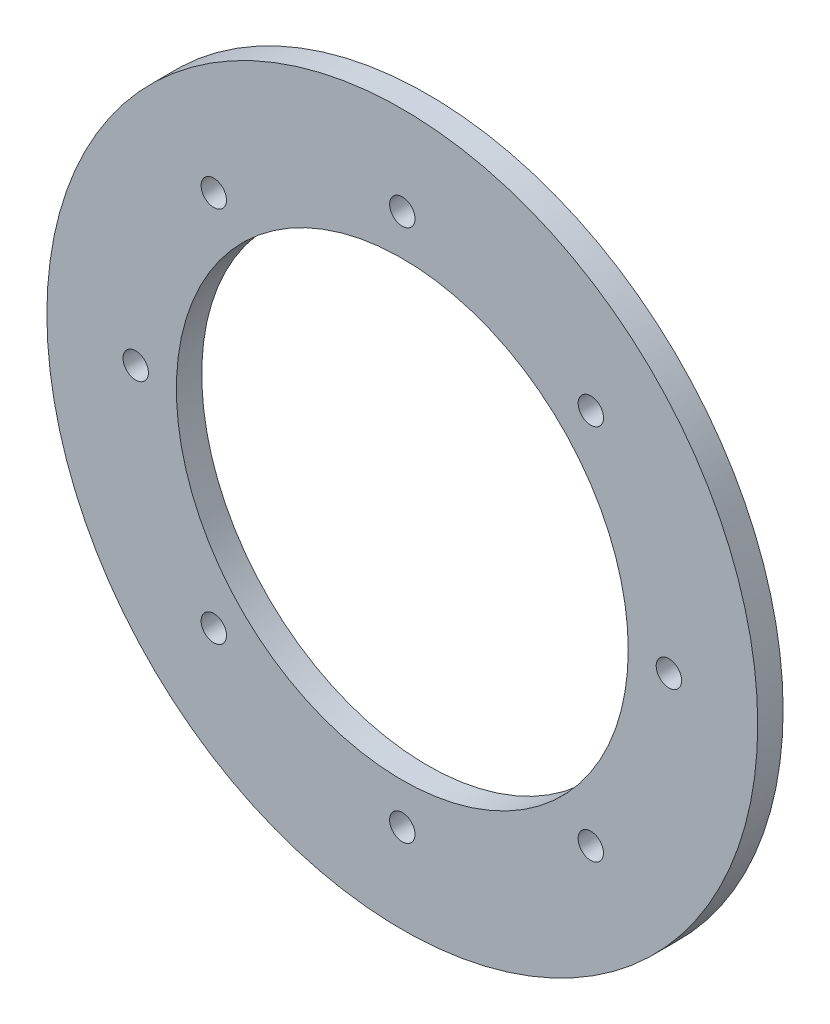
ISO-10303-21;
HEADER;
FILE_DESCRIPTION(('STEP AP214'),'2;1');
FILE_NAME('part.step','',(''),(''),'','','');
FILE_SCHEMA(('AUTOMOTIVE_DESIGN { 1 0 10303 214 1 1 1 1 }'));
ENDSEC;
DATA;
#1=APPLICATION_CONTEXT('core data for automotive mechanical design processes');
#2=APPLICATION_PROTOCOL_DEFINITION('international standard','automotive_design',2000,#1);
#3=PRODUCT_CONTEXT('',#1,'mechanical');
#4=PRODUCT('Part','Part','',(#3));
#5=PRODUCT_RELATED_PRODUCT_CATEGORY('part','',(#4));
#6=PRODUCT_DEFINITION_FORMATION('','',#4);
#7=PRODUCT_DEFINITION_CONTEXT('part definition',#1,'design');
#8=PRODUCT_DEFINITION('design','',#6,#7);
#9=PRODUCT_DEFINITION_SHAPE('','',#8);
#10=(LENGTH_UNIT() NAMED_UNIT(*) SI_UNIT(.MILLI.,.METRE.));
#11=(NAMED_UNIT(*) PLANE_ANGLE_UNIT() SI_UNIT($,.RADIAN.));
#12=(NAMED_UNIT(*) SI_UNIT($,.STERADIAN.) SOLID_ANGLE_UNIT());
#13=UNCERTAINTY_MEASURE_WITH_UNIT(LENGTH_MEASURE(1.E-05),#10,'distance_accuracy_value','');
#14=(GEOMETRIC_REPRESENTATION_CONTEXT(3) GLOBAL_UNCERTAINTY_ASSIGNED_CONTEXT((#13)) GLOBAL_UNIT_ASSIGNED_CONTEXT((#10,
#11,#12)) REPRESENTATION_CONTEXT('',''));
#15=CARTESIAN_POINT('',(0.,0.,0.));
#16=DIRECTION('',(0.,0.,1.));
#17=DIRECTION('',(1.,0.,0.));
#18=AXIS2_PLACEMENT_3D('',#15,#16,#17);
#19=CARTESIAN_POINT('',(0.,0.,5.));
#20=DIRECTION('',(0.,0.,1.));
#21=DIRECTION('',(1.,0.,0.));
#22=AXIS2_PLACEMENT_3D('',#19,#20,#21);
#23=PLANE('',#22);
#24=CARTESIAN_POINT('',(-37.1231060122937,37.1231060122937,5.));
#25=DIRECTION('',(0.,0.,1.));
#26=DIRECTION('',(1.,0.,0.));
#27=AXIS2_PLACEMENT_3D('',#24,#25,#26);
#28=CIRCLE('',#27,2.5);
#29=CARTESIAN_POINT('',(-34.6231060122937,37.1231060122937,5.));
#30=VERTEX_POINT('',#29);
#31=EDGE_CURVE('E87',#30,#30,#28,.T.);
#32=ORIENTED_EDGE('',*,*,#31,.F.);
#33=EDGE_LOOP('',(#32));
#34=FACE_BOUND('',#33,.T.);
#35=CARTESIAN_POINT('',(-52.5,0.,5.));
#36=DIRECTION('',(0.,0.,1.));
#37=DIRECTION('',(1.,0.,0.));
#38=AXIS2_PLACEMENT_3D('',#35,#36,#37);
#39=CIRCLE('',#38,2.49999999999999);
#40=CARTESIAN_POINT('',(-50.,0.,5.));
#41=VERTEX_POINT('',#40);
#42=EDGE_CURVE('E75',#41,#41,#39,.T.);
#43=ORIENTED_EDGE('',*,*,#42,.F.);
#44=EDGE_LOOP('',(#43));
#45=FACE_BOUND('',#44,.T.);
#46=CARTESIAN_POINT('',(0.,-52.5,5.));
#47=DIRECTION('',(0.,0.,1.));
#48=DIRECTION('',(1.,0.,0.));
#49=AXIS2_PLACEMENT_3D('',#46,#47,#48);
#50=CIRCLE('',#49,2.5);
#51=CARTESIAN_POINT('',(2.5,-52.5,5.));
#52=VERTEX_POINT('',#51);
#53=EDGE_CURVE('E63',#52,#52,#50,.T.);
#54=ORIENTED_EDGE('',*,*,#53,.F.);
#55=EDGE_LOOP('',(#54));
#56=FACE_BOUND('',#55,.T.);
#57=CARTESIAN_POINT('',(37.1231060122937,-37.1231060122937,5.));
#58=DIRECTION('',(0.,0.,1.));
#59=DIRECTION('',(1.,0.,0.));
#60=AXIS2_PLACEMENT_3D('',#57,#58,#59);
#61=CIRCLE('',#60,2.5);
#62=CARTESIAN_POINT('',(39.6231060122937,-37.1231060122937,5.));
#63=VERTEX_POINT('',#62);
#64=EDGE_CURVE('E51',#63,#63,#61,.T.);
#65=ORIENTED_EDGE('',*,*,#64,.F.);
#66=EDGE_LOOP('',(#65));
#67=FACE_BOUND('',#66,.T.);
#68=CARTESIAN_POINT('',(0.,0.,5.));
#69=DIRECTION('',(0.,0.,1.));
#70=DIRECTION('',(1.,0.,0.));
#71=AXIS2_PLACEMENT_3D('',#68,#69,#70);
#72=CIRCLE('',#71,70.);
#73=CARTESIAN_POINT('',(70.,0.,5.));
#74=VERTEX_POINT('',#73);
#75=EDGE_CURVE('E10',#74,#74,#72,.T.);
#76=ORIENTED_EDGE('',*,*,#75,.T.);
#77=EDGE_LOOP('',(#76));
#78=FACE_BOUND('',#77,.T.);
#79=CARTESIAN_POINT('',(0.,0.,5.));
#80=DIRECTION('',(0.,0.,1.));
#81=DIRECTION('',(1.,0.,0.));
#82=AXIS2_PLACEMENT_3D('',#79,#80,#81);
#83=CIRCLE('',#82,44.5);
#84=CARTESIAN_POINT('',(44.5,0.,5.));
#85=VERTEX_POINT('',#84);
#86=EDGE_CURVE('E46',#85,#85,#83,.T.);
#87=ORIENTED_EDGE('',*,*,#86,.F.);
#88=EDGE_LOOP('',(#87));
#89=FACE_BOUND('',#88,.T.);
#90=CARTESIAN_POINT('',(52.5,0.,5.));
#91=DIRECTION('',(0.,0.,1.));
#92=DIRECTION('',(1.,0.,0.));
#93=AXIS2_PLACEMENT_3D('',#90,#91,#92);
#94=CIRCLE('',#93,2.5);
#95=CARTESIAN_POINT('',(55.,0.,5.));
#96=VERTEX_POINT('',#95);
#97=EDGE_CURVE('E57',#96,#96,#94,.T.);
#98=ORIENTED_EDGE('',*,*,#97,.F.);
#99=EDGE_LOOP('',(#98));
#100=FACE_BOUND('',#99,.T.);
#101=CARTESIAN_POINT('',(-37.1231060122937,-37.1231060122937,5.));
#102=DIRECTION('',(0.,0.,1.));
#103=DIRECTION('',(1.,0.,0.));
#104=AXIS2_PLACEMENT_3D('',#101,#102,#103);
#105=CIRCLE('',#104,2.5);
#106=CARTESIAN_POINT('',(-34.6231060122937,-37.1231060122937,5.));
#107=VERTEX_POINT('',#106);
#108=EDGE_CURVE('E69',#107,#107,#105,.T.);
#109=ORIENTED_EDGE('',*,*,#108,.F.);
#110=EDGE_LOOP('',(#109));
#111=FACE_BOUND('',#110,.T.);
#112=CARTESIAN_POINT('',(37.1231060122937,37.1231060122937,5.));
#113=DIRECTION('',(0.,0.,1.));
#114=DIRECTION('',(1.,0.,0.));
#115=AXIS2_PLACEMENT_3D('',#112,#113,#114);
#116=CIRCLE('',#115,2.5);
#117=CARTESIAN_POINT('',(39.6231060122937,37.1231060122937,5.));
#118=VERTEX_POINT('',#117);
#119=EDGE_CURVE('E81',#118,#118,#116,.T.);
#120=ORIENTED_EDGE('',*,*,#119,.F.);
#121=EDGE_LOOP('',(#120));
#122=FACE_BOUND('',#121,.T.);
#123=CARTESIAN_POINT('',(0.,52.5,5.));
#124=DIRECTION('',(0.,0.,1.));
#125=DIRECTION('',(1.,0.,0.));
#126=AXIS2_PLACEMENT_3D('',#123,#124,#125);
#127=CIRCLE('',#126,2.5);
#128=CARTESIAN_POINT('',(2.5,52.5,5.));
#129=VERTEX_POINT('',#128);
#130=EDGE_CURVE('E93',#129,#129,#127,.T.);
#131=ORIENTED_EDGE('',*,*,#130,.F.);
#132=EDGE_LOOP('',(#131));
#133=FACE_BOUND('',#132,.T.);
#134=ADVANCED_FACE('F35',(#34,#45,#56,#67,#78,#89,#100,#111,#122,#133),#23,.T.);
#135=CARTESIAN_POINT('',(0.,0.,0.));
#136=DIRECTION('',(0.,0.,1.));
#137=DIRECTION('',(1.,0.,0.));
#138=AXIS2_PLACEMENT_3D('',#135,#136,#137);
#139=PLANE('',#138);
#140=CARTESIAN_POINT('',(0.,0.,0.));
#141=DIRECTION('',(0.,0.,1.));
#142=DIRECTION('',(1.,0.,0.));
#143=AXIS2_PLACEMENT_3D('',#140,#141,#142);
#144=CIRCLE('',#143,70.);
#145=CARTESIAN_POINT('',(70.,0.,0.));
#146=VERTEX_POINT('',#145);
#147=EDGE_CURVE('E39',#146,#146,#144,.T.);
#148=ORIENTED_EDGE('',*,*,#147,.F.);
#149=EDGE_LOOP('',(#148));
#150=FACE_BOUND('',#149,.T.);
#151=CARTESIAN_POINT('',(0.,0.,0.));
#152=DIRECTION('',(0.,0.,1.));
#153=DIRECTION('',(1.,0.,0.));
#154=AXIS2_PLACEMENT_3D('',#151,#152,#153);
#155=CIRCLE('',#154,44.5);
#156=CARTESIAN_POINT('',(44.5,0.,0.));
#157=VERTEX_POINT('',#156);
#158=EDGE_CURVE('E48',#157,#157,#155,.T.);
#159=ORIENTED_EDGE('',*,*,#158,.T.);
#160=EDGE_LOOP('',(#159));
#161=FACE_BOUND('',#160,.T.);
#162=CARTESIAN_POINT('',(37.1231060122937,-37.1231060122937,0.));
#163=DIRECTION('',(0.,0.,1.));
#164=DIRECTION('',(1.,0.,0.));
#165=AXIS2_PLACEMENT_3D('',#162,#163,#164);
#166=CIRCLE('',#165,2.5);
#167=CARTESIAN_POINT('',(39.6231060122937,-37.1231060122937,0.));
#168=VERTEX_POINT('',#167);
#169=EDGE_CURVE('E54',#168,#168,#166,.T.);
#170=ORIENTED_EDGE('',*,*,#169,.T.);
#171=EDGE_LOOP('',(#170));
#172=FACE_BOUND('',#171,.T.);
#173=CARTESIAN_POINT('',(52.5,0.,0.));
#174=DIRECTION('',(0.,0.,1.));
#175=DIRECTION('',(1.,0.,0.));
#176=AXIS2_PLACEMENT_3D('',#173,#174,#175);
#177=CIRCLE('',#176,2.5);
#178=CARTESIAN_POINT('',(55.,0.,0.));
#179=VERTEX_POINT('',#178);
#180=EDGE_CURVE('E60',#179,#179,#177,.T.);
#181=ORIENTED_EDGE('',*,*,#180,.T.);
#182=EDGE_LOOP('',(#181));
#183=FACE_BOUND('',#182,.T.);
#184=CARTESIAN_POINT('',(0.,-52.5,0.));
#185=DIRECTION('',(0.,0.,1.));
#186=DIRECTION('',(1.,0.,0.));
#187=AXIS2_PLACEMENT_3D('',#184,#185,#186);
#188=CIRCLE('',#187,2.5);
#189=CARTESIAN_POINT('',(2.5,-52.5,0.));
#190=VERTEX_POINT('',#189);
#191=EDGE_CURVE('E66',#190,#190,#188,.T.);
#192=ORIENTED_EDGE('',*,*,#191,.T.);
#193=EDGE_LOOP('',(#192));
#194=FACE_BOUND('',#193,.T.);
#195=CARTESIAN_POINT('',(-37.1231060122937,-37.1231060122937,0.));
#196=DIRECTION('',(0.,0.,1.));
#197=DIRECTION('',(1.,0.,0.));
#198=AXIS2_PLACEMENT_3D('',#195,#196,#197);
#199=CIRCLE('',#198,2.5);
#200=CARTESIAN_POINT('',(-34.6231060122937,-37.1231060122937,0.));
#201=VERTEX_POINT('',#200);
#202=EDGE_CURVE('E72',#201,#201,#199,.T.);
#203=ORIENTED_EDGE('',*,*,#202,.T.);
#204=EDGE_LOOP('',(#203));
#205=FACE_BOUND('',#204,.T.);
#206=CARTESIAN_POINT('',(-52.5,0.,0.));
#207=DIRECTION('',(0.,0.,1.));
#208=DIRECTION('',(1.,0.,0.));
#209=AXIS2_PLACEMENT_3D('',#206,#207,#208);
#210=CIRCLE('',#209,2.49999999999999);
#211=CARTESIAN_POINT('',(-50.,0.,0.));
#212=VERTEX_POINT('',#211);
#213=EDGE_CURVE('E78',#212,#212,#210,.T.);
#214=ORIENTED_EDGE('',*,*,#213,.T.);
#215=EDGE_LOOP('',(#214));
#216=FACE_BOUND('',#215,.T.);
#217=CARTESIAN_POINT('',(37.1231060122937,37.1231060122937,0.));
#218=DIRECTION('',(0.,0.,1.));
#219=DIRECTION('',(1.,0.,0.));
#220=AXIS2_PLACEMENT_3D('',#217,#218,#219);
#221=CIRCLE('',#220,2.5);
#222=CARTESIAN_POINT('',(39.6231060122937,37.1231060122937,0.));
#223=VERTEX_POINT('',#222);
#224=EDGE_CURVE('E84',#223,#223,#221,.T.);
#225=ORIENTED_EDGE('',*,*,#224,.T.);
#226=EDGE_LOOP('',(#225));
#227=FACE_BOUND('',#226,.T.);
#228=CARTESIAN_POINT('',(-37.1231060122937,37.1231060122937,0.));
#229=DIRECTION('',(0.,0.,1.));
#230=DIRECTION('',(1.,0.,0.));
#231=AXIS2_PLACEMENT_3D('',#228,#229,#230);
#232=CIRCLE('',#231,2.5);
#233=CARTESIAN_POINT('',(-34.6231060122937,37.1231060122937,0.));
#234=VERTEX_POINT('',#233);
#235=EDGE_CURVE('E90',#234,#234,#232,.T.);
#236=ORIENTED_EDGE('',*,*,#235,.T.);
#237=EDGE_LOOP('',(#236));
#238=FACE_BOUND('',#237,.T.);
#239=CARTESIAN_POINT('',(0.,52.5,0.));
#240=DIRECTION('',(0.,0.,1.));
#241=DIRECTION('',(1.,0.,0.));
#242=AXIS2_PLACEMENT_3D('',#239,#240,#241);
#243=CIRCLE('',#242,2.5);
#244=CARTESIAN_POINT('',(2.5,52.5,0.));
#245=VERTEX_POINT('',#244);
#246=EDGE_CURVE('E96',#245,#245,#243,.T.);
#247=ORIENTED_EDGE('',*,*,#246,.T.);
#248=EDGE_LOOP('',(#247));
#249=FACE_BOUND('',#248,.T.);
#250=ADVANCED_FACE('F106',(#150,#161,#172,#183,#194,#205,#216,#227,#238,#249),#139,.F.);
#251=CARTESIAN_POINT('',(0.,0.,5.));
#252=DIRECTION('',(0.,0.,-1.));
#253=DIRECTION('',(-1.,0.,0.));
#254=AXIS2_PLACEMENT_3D('',#251,#252,#253);
#255=CYLINDRICAL_SURFACE('',#254,70.);
#256=ORIENTED_EDGE('',*,*,#75,.F.);
#257=EDGE_LOOP('',(#256));
#258=FACE_BOUND('',#257,.T.);
#259=ORIENTED_EDGE('',*,*,#147,.T.);
#260=EDGE_LOOP('',(#259));
#261=FACE_BOUND('',#260,.T.);
#262=ADVANCED_FACE('F37',(#258,#261),#255,.T.);
#263=CARTESIAN_POINT('',(0.,0.,5.));
#264=DIRECTION('',(0.,0.,-1.));
#265=DIRECTION('',(-1.,0.,0.));
#266=AXIS2_PLACEMENT_3D('',#263,#264,#265);
#267=CYLINDRICAL_SURFACE('',#266,44.5);
#268=ORIENTED_EDGE('',*,*,#86,.T.);
#269=EDGE_LOOP('',(#268));
#270=FACE_BOUND('',#269,.T.);
#271=ORIENTED_EDGE('',*,*,#158,.F.);
#272=EDGE_LOOP('',(#271));
#273=FACE_BOUND('',#272,.T.);
#274=ADVANCED_FACE('F116',(#270,#273),#267,.F.);
#275=CARTESIAN_POINT('',(37.1231060122937,-37.1231060122937,5.));
#276=DIRECTION('',(0.,0.,-1.));
#277=DIRECTION('',(-1.,0.,0.));
#278=AXIS2_PLACEMENT_3D('',#275,#276,#277);
#279=CYLINDRICAL_SURFACE('',#278,2.5);
#280=ORIENTED_EDGE('',*,*,#64,.T.);
#281=EDGE_LOOP('',(#280));
#282=FACE_BOUND('',#281,.T.);
#283=ORIENTED_EDGE('',*,*,#169,.F.);
#284=EDGE_LOOP('',(#283));
#285=FACE_BOUND('',#284,.T.);
#286=ADVANCED_FACE('F119',(#282,#285),#279,.F.);
#287=CARTESIAN_POINT('',(52.5,0.,5.));
#288=DIRECTION('',(0.,0.,-1.));
#289=DIRECTION('',(-1.,0.,0.));
#290=AXIS2_PLACEMENT_3D('',#287,#288,#289);
#291=CYLINDRICAL_SURFACE('',#290,2.5);
#292=ORIENTED_EDGE('',*,*,#97,.T.);
#293=EDGE_LOOP('',(#292));
#294=FACE_BOUND('',#293,.T.);
#295=ORIENTED_EDGE('',*,*,#180,.F.);
#296=EDGE_LOOP('',(#295));
#297=FACE_BOUND('',#296,.T.);
#298=ADVANCED_FACE('F123',(#294,#297),#291,.F.);
#299=CARTESIAN_POINT('',(0.,-52.5,5.));
#300=DIRECTION('',(0.,0.,-1.));
#301=DIRECTION('',(-1.,0.,0.));
#302=AXIS2_PLACEMENT_3D('',#299,#300,#301);
#303=CYLINDRICAL_SURFACE('',#302,2.5);
#304=ORIENTED_EDGE('',*,*,#53,.T.);
#305=EDGE_LOOP('',(#304));
#306=FACE_BOUND('',#305,.T.);
#307=ORIENTED_EDGE('',*,*,#191,.F.);
#308=EDGE_LOOP('',(#307));
#309=FACE_BOUND('',#308,.T.);
#310=ADVANCED_FACE('F127',(#306,#309),#303,.F.);
#311=CARTESIAN_POINT('',(-37.1231060122937,-37.1231060122937,5.));
#312=DIRECTION('',(0.,0.,-1.));
#313=DIRECTION('',(-1.,0.,0.));
#314=AXIS2_PLACEMENT_3D('',#311,#312,#313);
#315=CYLINDRICAL_SURFACE('',#314,2.5);
#316=ORIENTED_EDGE('',*,*,#108,.T.);
#317=EDGE_LOOP('',(#316));
#318=FACE_BOUND('',#317,.T.);
#319=ORIENTED_EDGE('',*,*,#202,.F.);
#320=EDGE_LOOP('',(#319));
#321=FACE_BOUND('',#320,.T.);
#322=ADVANCED_FACE('F131',(#318,#321),#315,.F.);
#323=CARTESIAN_POINT('',(-52.5,0.,5.));
#324=DIRECTION('',(0.,0.,-1.));
#325=DIRECTION('',(-1.,0.,0.));
#326=AXIS2_PLACEMENT_3D('',#323,#324,#325);
#327=CYLINDRICAL_SURFACE('',#326,2.49999999999999);
#328=ORIENTED_EDGE('',*,*,#42,.T.);
#329=EDGE_LOOP('',(#328));
#330=FACE_BOUND('',#329,.T.);
#331=ORIENTED_EDGE('',*,*,#213,.F.);
#332=EDGE_LOOP('',(#331));
#333=FACE_BOUND('',#332,.T.);
#334=ADVANCED_FACE('F135',(#330,#333),#327,.F.);
#335=CARTESIAN_POINT('',(37.1231060122937,37.1231060122937,5.));
#336=DIRECTION('',(0.,0.,-1.));
#337=DIRECTION('',(-1.,0.,0.));
#338=AXIS2_PLACEMENT_3D('',#335,#336,#337);
#339=CYLINDRICAL_SURFACE('',#338,2.5);
#340=ORIENTED_EDGE('',*,*,#119,.T.);
#341=EDGE_LOOP('',(#340));
#342=FACE_BOUND('',#341,.T.);
#343=ORIENTED_EDGE('',*,*,#224,.F.);
#344=EDGE_LOOP('',(#343));
#345=FACE_BOUND('',#344,.T.);
#346=ADVANCED_FACE('F139',(#342,#345),#339,.F.);
#347=CARTESIAN_POINT('',(-37.1231060122937,37.1231060122937,5.));
#348=DIRECTION('',(0.,0.,-1.));
#349=DIRECTION('',(-1.,0.,0.));
#350=AXIS2_PLACEMENT_3D('',#347,#348,#349);
#351=CYLINDRICAL_SURFACE('',#350,2.5);
#352=ORIENTED_EDGE('',*,*,#31,.T.);
#353=EDGE_LOOP('',(#352));
#354=FACE_BOUND('',#353,.T.);
#355=ORIENTED_EDGE('',*,*,#235,.F.);
#356=EDGE_LOOP('',(#355));
#357=FACE_BOUND('',#356,.T.);
#358=ADVANCED_FACE('F143',(#354,#357),#351,.F.);
#359=CARTESIAN_POINT('',(0.,52.5,5.));
#360=DIRECTION('',(0.,0.,-1.));
#361=DIRECTION('',(-1.,0.,0.));
#362=AXIS2_PLACEMENT_3D('',#359,#360,#361);
#363=CYLINDRICAL_SURFACE('',#362,2.5);
#364=ORIENTED_EDGE('',*,*,#130,.T.);
#365=EDGE_LOOP('',(#364));
#366=FACE_BOUND('',#365,.T.);
#367=ORIENTED_EDGE('',*,*,#246,.F.);
#368=EDGE_LOOP('',(#367));
#369=FACE_BOUND('',#368,.T.);
#370=ADVANCED_FACE('F102',(#366,#369),#363,.F.);
#371=CLOSED_SHELL('',(#134,#250,#262,#274,#286,#298,#310,#322,#334,#346,#358,#370));
#372=MANIFOLD_SOLID_BREP('B2',#371);
#373=ADVANCED_BREP_SHAPE_REPRESENTATION('',(#18,#372),#14);
#374=SHAPE_DEFINITION_REPRESENTATION(#9,#373);
ENDSEC;
END-ISO-10303-21;
